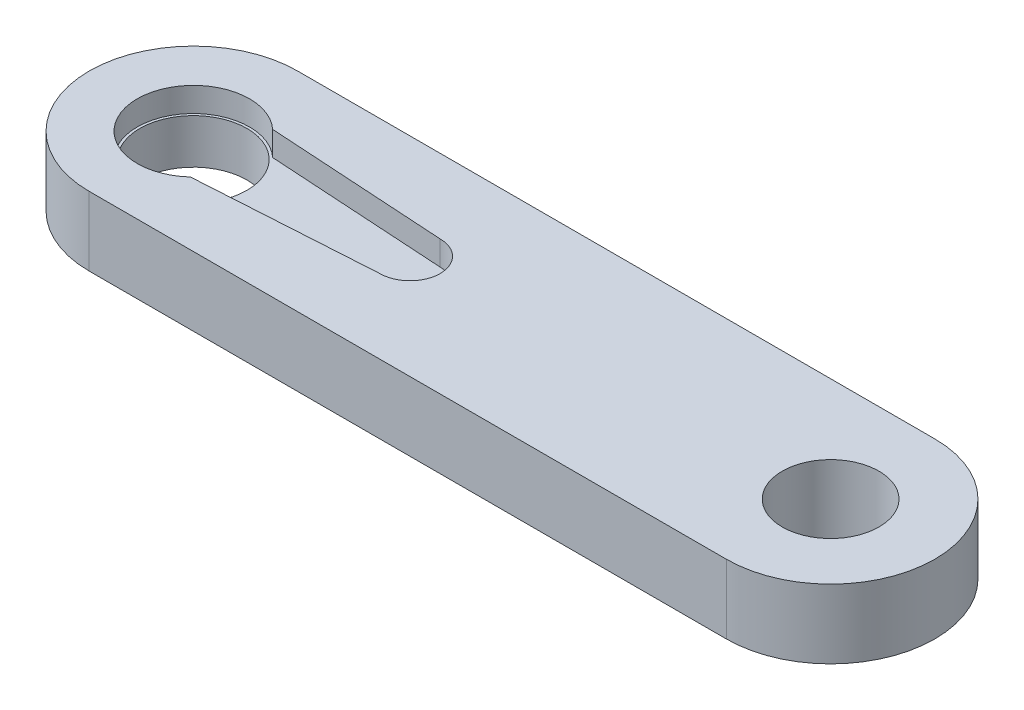
ISO-10303-21;
HEADER;
FILE_DESCRIPTION(('STEP AP214'),'2;1');
FILE_NAME('part.step','',(''),(''),'','','');
FILE_SCHEMA(('AUTOMOTIVE_DESIGN { 1 0 10303 214 1 1 1 1 }'));
ENDSEC;
DATA;
#1=APPLICATION_CONTEXT('core data for automotive mechanical design processes');
#2=APPLICATION_PROTOCOL_DEFINITION('international standard','automotive_design',2000,#1);
#3=PRODUCT_CONTEXT('',#1,'mechanical');
#4=PRODUCT('Part','Part','',(#3));
#5=PRODUCT_RELATED_PRODUCT_CATEGORY('part','',(#4));
#6=PRODUCT_DEFINITION_FORMATION('','',#4);
#7=PRODUCT_DEFINITION_CONTEXT('part definition',#1,'design');
#8=PRODUCT_DEFINITION('design','',#6,#7);
#9=PRODUCT_DEFINITION_SHAPE('','',#8);
#10=(LENGTH_UNIT() NAMED_UNIT(*) SI_UNIT(.MILLI.,.METRE.));
#11=(NAMED_UNIT(*) PLANE_ANGLE_UNIT() SI_UNIT($,.RADIAN.));
#12=(NAMED_UNIT(*) SI_UNIT($,.STERADIAN.) SOLID_ANGLE_UNIT());
#13=UNCERTAINTY_MEASURE_WITH_UNIT(LENGTH_MEASURE(1.E-05),#10,'distance_accuracy_value','');
#14=(GEOMETRIC_REPRESENTATION_CONTEXT(3) GLOBAL_UNCERTAINTY_ASSIGNED_CONTEXT((#13)) GLOBAL_UNIT_ASSIGNED_CONTEXT((#10,
#11,#12)) REPRESENTATION_CONTEXT('',''));
#15=CARTESIAN_POINT('',(0.,0.,0.));
#16=DIRECTION('',(0.,0.,1.));
#17=DIRECTION('',(1.,0.,0.));
#18=AXIS2_PLACEMENT_3D('',#15,#16,#17);
#19=CARTESIAN_POINT('',(12.2,3.,-7.));
#20=DIRECTION('',(0.,0.,1.));
#21=DIRECTION('',(1.,0.,0.));
#22=AXIS2_PLACEMENT_3D('',#19,#20,#21);
#23=PLANE('',#22);
#24=DIRECTION('',(-1.,0.,0.));
#25=VECTOR('',#24,1.);
#26=CARTESIAN_POINT('',(67.2,4.64,-7.));
#27=LINE('',#26,#25);
#28=CARTESIAN_POINT('',(55.,4.64,-7.));
#29=VERTEX_POINT('',#28);
#30=CARTESIAN_POINT('',(12.2,4.64,-7.));
#31=VERTEX_POINT('',#30);
#32=EDGE_CURVE('E137',#29,#31,#27,.T.);
#33=ORIENTED_EDGE('',*,*,#32,.F.);
#34=DIRECTION('',(0.,-1.,0.));
#35=VECTOR('',#34,1.);
#36=CARTESIAN_POINT('',(55.,3.,-7.));
#37=LINE('',#36,#35);
#38=CARTESIAN_POINT('',(55.,0.,-7.));
#39=VERTEX_POINT('',#38);
#40=EDGE_CURVE('E136',#29,#39,#37,.T.);
#41=ORIENTED_EDGE('',*,*,#40,.T.);
#42=DIRECTION('',(-1.,0.,0.));
#43=VECTOR('',#42,1.);
#44=CARTESIAN_POINT('',(12.2,0.,-7.));
#45=LINE('',#44,#43);
#46=CARTESIAN_POINT('',(12.2,0.,-7.));
#47=VERTEX_POINT('',#46);
#48=EDGE_CURVE('E134',#39,#47,#45,.T.);
#49=ORIENTED_EDGE('',*,*,#48,.T.);
#50=DIRECTION('',(0.,-1.,0.));
#51=VECTOR('',#50,1.);
#52=CARTESIAN_POINT('',(12.2,3.,-7.));
#53=LINE('',#52,#51);
#54=EDGE_CURVE('E155',#31,#47,#53,.T.);
#55=ORIENTED_EDGE('',*,*,#54,.F.);
#56=EDGE_LOOP('',(#33,#41,#49,#55));
#57=FACE_BOUND('',#56,.T.);
#58=ADVANCED_FACE('F40',(#57),#23,.F.);
#59=CARTESIAN_POINT('',(12.2,3.,7.));
#60=DIRECTION('',(0.,0.,-1.));
#61=DIRECTION('',(-1.,0.,0.));
#62=AXIS2_PLACEMENT_3D('',#59,#60,#61);
#63=PLANE('',#62);
#64=DIRECTION('',(1.,0.,0.));
#65=VECTOR('',#64,1.);
#66=CARTESIAN_POINT('',(12.2,0.,7.));
#67=LINE('',#66,#65);
#68=CARTESIAN_POINT('',(12.2,0.,7.));
#69=VERTEX_POINT('',#68);
#70=CARTESIAN_POINT('',(55.,0.,7.));
#71=VERTEX_POINT('',#70);
#72=EDGE_CURVE('E129',#69,#71,#67,.T.);
#73=ORIENTED_EDGE('',*,*,#72,.T.);
#74=DIRECTION('',(0.,-1.,0.));
#75=VECTOR('',#74,1.);
#76=CARTESIAN_POINT('',(55.,3.,7.));
#77=LINE('',#76,#75);
#78=CARTESIAN_POINT('',(55.,4.64,7.));
#79=VERTEX_POINT('',#78);
#80=EDGE_CURVE('E219',#79,#71,#77,.T.);
#81=ORIENTED_EDGE('',*,*,#80,.F.);
#82=DIRECTION('',(1.,0.,0.));
#83=VECTOR('',#82,1.);
#84=CARTESIAN_POINT('',(12.2,4.64,7.));
#85=LINE('',#84,#83);
#86=CARTESIAN_POINT('',(12.2,4.64,7.));
#87=VERTEX_POINT('',#86);
#88=EDGE_CURVE('E43',#87,#79,#85,.T.);
#89=ORIENTED_EDGE('',*,*,#88,.F.);
#90=DIRECTION('',(0.,-1.,0.));
#91=VECTOR('',#90,1.);
#92=CARTESIAN_POINT('',(12.2,3.,7.));
#93=LINE('',#92,#91);
#94=EDGE_CURVE('E133',#87,#69,#93,.T.);
#95=ORIENTED_EDGE('',*,*,#94,.T.);
#96=EDGE_LOOP('',(#73,#81,#89,#95));
#97=FACE_BOUND('',#96,.T.);
#98=ADVANCED_FACE('F196',(#97),#63,.F.);
#99=CARTESIAN_POINT('',(67.2,0.,0.));
#100=DIRECTION('',(0.,1.,0.));
#101=DIRECTION('',(0.,0.,1.));
#102=AXIS2_PLACEMENT_3D('',#99,#100,#101);
#103=PLANE('',#102);
#104=CARTESIAN_POINT('',(12.2,0.,0.));
#105=DIRECTION('',(0.,-1.,0.));
#106=DIRECTION('',(0.,0.,-1.));
#107=AXIS2_PLACEMENT_3D('',#104,#105,#106);
#108=CIRCLE('',#107,3.6);
#109=CARTESIAN_POINT('',(12.2,0.,-3.6));
#110=VERTEX_POINT('',#109);
#111=EDGE_CURVE('E128',#110,#110,#108,.T.);
#112=ORIENTED_EDGE('',*,*,#111,.F.);
#113=EDGE_LOOP('',(#112));
#114=FACE_BOUND('',#113,.T.);
#115=ORIENTED_EDGE('',*,*,#48,.F.);
#116=CARTESIAN_POINT('',(55.,0.,0.));
#117=DIRECTION('',(0.,1.,0.));
#118=DIRECTION('',(0.,0.,1.));
#119=AXIS2_PLACEMENT_3D('',#116,#117,#118);
#120=CIRCLE('',#119,7.);
#121=EDGE_CURVE('E217',#71,#39,#120,.T.);
#122=ORIENTED_EDGE('',*,*,#121,.F.);
#123=ORIENTED_EDGE('',*,*,#72,.F.);
#124=CARTESIAN_POINT('',(12.2,0.,0.));
#125=DIRECTION('',(0.,1.,0.));
#126=DIRECTION('',(0.,0.,1.));
#127=AXIS2_PLACEMENT_3D('',#124,#125,#126);
#128=CIRCLE('',#127,7.);
#129=EDGE_CURVE('E157',#47,#69,#128,.T.);
#130=ORIENTED_EDGE('',*,*,#129,.F.);
#131=EDGE_LOOP('',(#115,#122,#123,#130));
#132=FACE_BOUND('',#131,.T.);
#133=CARTESIAN_POINT('',(55.,0.,0.));
#134=DIRECTION('',(0.,1.,0.));
#135=DIRECTION('',(0.,0.,1.));
#136=AXIS2_PLACEMENT_3D('',#133,#134,#135);
#137=CIRCLE('',#136,3.25);
#138=CARTESIAN_POINT('',(55.,0.,3.25));
#139=VERTEX_POINT('',#138);
#140=EDGE_CURVE('E223',#139,#139,#137,.F.);
#141=ORIENTED_EDGE('',*,*,#140,.F.);
#142=EDGE_LOOP('',(#141));
#143=FACE_BOUND('',#142,.T.);
#144=ADVANCED_FACE('F201',(#114,#132,#143),#103,.F.);
#145=CARTESIAN_POINT('',(12.2,4.64,0.));
#146=DIRECTION('',(0.,1.,0.));
#147=DIRECTION('',(0.,0.,1.));
#148=AXIS2_PLACEMENT_3D('',#145,#146,#147);
#149=PLANE('',#148);
#150=ORIENTED_EDGE('',*,*,#88,.T.);
#151=CARTESIAN_POINT('',(55.,4.64,0.));
#152=DIRECTION('',(0.,1.,0.));
#153=DIRECTION('',(0.,0.,1.));
#154=AXIS2_PLACEMENT_3D('',#151,#152,#153);
#155=CIRCLE('',#154,7.);
#156=EDGE_CURVE('E215',#79,#29,#155,.T.);
#157=ORIENTED_EDGE('',*,*,#156,.T.);
#158=ORIENTED_EDGE('',*,*,#32,.T.);
#159=CARTESIAN_POINT('',(12.2,4.64,0.));
#160=DIRECTION('',(0.,1.,0.));
#161=DIRECTION('',(0.,0.,1.));
#162=AXIS2_PLACEMENT_3D('',#159,#160,#161);
#163=CIRCLE('',#162,7.);
#164=EDGE_CURVE('E139',#31,#87,#163,.T.);
#165=ORIENTED_EDGE('',*,*,#164,.T.);
#166=EDGE_LOOP('',(#150,#157,#158,#165));
#167=FACE_BOUND('',#166,.T.);
#168=DIRECTION('',(-0.998071858143405,0.,-0.0620690420593882));
#169=VECTOR('',#168,1.);
#170=CARTESIAN_POINT('',(26.7553968890811,4.64,-2.01999279047927));
#171=LINE('',#170,#169);
#172=CARTESIAN_POINT('',(26.7553968890811,4.64,-2.01999279047927));
#173=VERTEX_POINT('',#172);
#174=CARTESIAN_POINT('',(14.7618184422242,4.64,-2.76586085497446));
#175=VERTEX_POINT('',#174);
#176=EDGE_CURVE('E92',#173,#175,#171,.T.);
#177=ORIENTED_EDGE('',*,*,#176,.F.);
#178=CARTESIAN_POINT('',(26.75,4.64,0.));
#179=DIRECTION('',(0.,1.,0.));
#180=DIRECTION('',(0.,0.,1.));
#181=AXIS2_PLACEMENT_3D('',#178,#179,#180);
#182=CIRCLE('',#181,2.02);
#183=CARTESIAN_POINT('',(26.7553968890812,4.64,2.01999279047927));
#184=VERTEX_POINT('',#183);
#185=EDGE_CURVE('E124',#184,#173,#182,.T.);
#186=ORIENTED_EDGE('',*,*,#185,.F.);
#187=DIRECTION('',(0.998071858143405,0.,-0.0620690420593882));
#188=VECTOR('',#187,1.);
#189=CARTESIAN_POINT('',(14.7618184422242,4.64,2.76586085497446));
#190=LINE('',#189,#188);
#191=CARTESIAN_POINT('',(14.7618184422242,4.64,2.76586085497446));
#192=VERTEX_POINT('',#191);
#193=EDGE_CURVE('E50',#192,#184,#190,.T.);
#194=ORIENTED_EDGE('',*,*,#193,.F.);
#195=CARTESIAN_POINT('',(12.2,4.64,0.));
#196=DIRECTION('',(0.,1.,0.));
#197=DIRECTION('',(0.,0.,-1.));
#198=AXIS2_PLACEMENT_3D('',#195,#196,#197);
#199=CIRCLE('',#198,3.77);
#200=EDGE_CURVE('E107',#175,#192,#199,.T.);
#201=ORIENTED_EDGE('',*,*,#200,.F.);
#202=EDGE_LOOP('',(#177,#186,#194,#201));
#203=FACE_BOUND('',#202,.T.);
#204=CARTESIAN_POINT('',(55.,4.64,0.));
#205=DIRECTION('',(0.,1.,0.));
#206=DIRECTION('',(0.,0.,1.));
#207=AXIS2_PLACEMENT_3D('',#204,#205,#206);
#208=CIRCLE('',#207,3.25);
#209=CARTESIAN_POINT('',(55.,4.64,3.25));
#210=VERTEX_POINT('',#209);
#211=EDGE_CURVE('E229',#210,#210,#208,.T.);
#212=ORIENTED_EDGE('',*,*,#211,.F.);
#213=EDGE_LOOP('',(#212));
#214=FACE_BOUND('',#213,.T.);
#215=ADVANCED_FACE('F114',(#167,#203,#214),#149,.T.);
#216=CARTESIAN_POINT('',(67.2,3.,0.));
#217=DIRECTION('',(0.,1.,0.));
#218=DIRECTION('',(0.,0.,1.));
#219=AXIS2_PLACEMENT_3D('',#216,#217,#218);
#220=PLANE('',#219);
#221=CARTESIAN_POINT('',(12.2,3.,0.));
#222=DIRECTION('',(0.,1.,0.));
#223=DIRECTION('',(0.,0.,1.));
#224=AXIS2_PLACEMENT_3D('',#221,#222,#223);
#225=CIRCLE('',#224,3.6);
#226=CARTESIAN_POINT('',(12.2,3.,3.6));
#227=VERTEX_POINT('',#226);
#228=EDGE_CURVE('E160',#227,#227,#225,.T.);
#229=ORIENTED_EDGE('',*,*,#228,.F.);
#230=EDGE_LOOP('',(#229));
#231=FACE_BOUND('',#230,.T.);
#232=DIRECTION('',(0.998071858143405,0.,-0.0620690420593882));
#233=VECTOR('',#232,1.);
#234=CARTESIAN_POINT('',(14.7618184422242,3.,2.76586085497446));
#235=LINE('',#234,#233);
#236=CARTESIAN_POINT('',(14.7618184422242,3.,2.76586085497446));
#237=VERTEX_POINT('',#236);
#238=CARTESIAN_POINT('',(26.7553968890812,3.,2.01999279047927));
#239=VERTEX_POINT('',#238);
#240=EDGE_CURVE('E169',#237,#239,#235,.T.);
#241=ORIENTED_EDGE('',*,*,#240,.T.);
#242=CARTESIAN_POINT('',(26.75,3.,0.));
#243=DIRECTION('',(0.,1.,0.));
#244=DIRECTION('',(0.,0.,1.));
#245=AXIS2_PLACEMENT_3D('',#242,#243,#244);
#246=CIRCLE('',#245,2.02);
#247=CARTESIAN_POINT('',(26.7553968890811,3.,-2.01999279047927));
#248=VERTEX_POINT('',#247);
#249=EDGE_CURVE('E173',#239,#248,#246,.T.);
#250=ORIENTED_EDGE('',*,*,#249,.T.);
#251=DIRECTION('',(-0.998071858143405,0.,-0.0620690420593882));
#252=VECTOR('',#251,1.);
#253=CARTESIAN_POINT('',(26.7553968890811,3.,-2.01999279047927));
#254=LINE('',#253,#252);
#255=CARTESIAN_POINT('',(14.7618184422242,3.,-2.76586085497446));
#256=VERTEX_POINT('',#255);
#257=EDGE_CURVE('E176',#248,#256,#254,.T.);
#258=ORIENTED_EDGE('',*,*,#257,.T.);
#259=CARTESIAN_POINT('',(12.2,3.,0.));
#260=DIRECTION('',(0.,1.,0.));
#261=DIRECTION('',(0.,0.,-1.));
#262=AXIS2_PLACEMENT_3D('',#259,#260,#261);
#263=CIRCLE('',#262,3.77);
#264=EDGE_CURVE('E110',#256,#237,#263,.T.);
#265=ORIENTED_EDGE('',*,*,#264,.T.);
#266=EDGE_LOOP('',(#241,#250,#258,#265));
#267=FACE_BOUND('',#266,.T.);
#268=ADVANCED_FACE('F181',(#231,#267),#220,.T.);
#269=CARTESIAN_POINT('',(12.2,3.,0.));
#270=DIRECTION('',(0.,-1.,0.));
#271=DIRECTION('',(0.,0.,-1.));
#272=AXIS2_PLACEMENT_3D('',#269,#270,#271);
#273=CYLINDRICAL_SURFACE('',#272,7.);
#274=ORIENTED_EDGE('',*,*,#129,.T.);
#275=ORIENTED_EDGE('',*,*,#94,.F.);
#276=ORIENTED_EDGE('',*,*,#164,.F.);
#277=ORIENTED_EDGE('',*,*,#54,.T.);
#278=EDGE_LOOP('',(#274,#275,#276,#277));
#279=FACE_BOUND('',#278,.T.);
#280=ADVANCED_FACE('F192',(#279),#273,.T.);
#281=CARTESIAN_POINT('',(12.2,3.95,0.));
#282=DIRECTION('',(0.,-1.,0.));
#283=DIRECTION('',(0.,0.,-1.));
#284=AXIS2_PLACEMENT_3D('',#281,#282,#283);
#285=CYLINDRICAL_SURFACE('',#284,3.6);
#286=ORIENTED_EDGE('',*,*,#228,.T.);
#287=EDGE_LOOP('',(#286));
#288=FACE_BOUND('',#287,.T.);
#289=ORIENTED_EDGE('',*,*,#111,.T.);
#290=EDGE_LOOP('',(#289));
#291=FACE_BOUND('',#290,.T.);
#292=ADVANCED_FACE('F185',(#288,#291),#285,.F.);
#293=CARTESIAN_POINT('',(26.75,4.64,0.));
#294=DIRECTION('',(0.,-1.,0.));
#295=DIRECTION('',(0.,0.,-1.));
#296=AXIS2_PLACEMENT_3D('',#293,#294,#295);
#297=CYLINDRICAL_SURFACE('',#296,2.02);
#298=ORIENTED_EDGE('',*,*,#249,.F.);
#299=DIRECTION('',(0.,-1.,0.));
#300=VECTOR('',#299,1.);
#301=CARTESIAN_POINT('',(26.7553968890812,4.64,2.01999279047927));
#302=LINE('',#301,#300);
#303=EDGE_CURVE('E11',#184,#239,#302,.T.);
#304=ORIENTED_EDGE('',*,*,#303,.F.);
#305=ORIENTED_EDGE('',*,*,#185,.T.);
#306=DIRECTION('',(0.,-1.,0.));
#307=VECTOR('',#306,1.);
#308=CARTESIAN_POINT('',(26.7553968890811,4.64,-2.01999279047927));
#309=LINE('',#308,#307);
#310=EDGE_CURVE('E98',#173,#248,#309,.T.);
#311=ORIENTED_EDGE('',*,*,#310,.T.);
#312=EDGE_LOOP('',(#298,#304,#305,#311));
#313=FACE_BOUND('',#312,.T.);
#314=ADVANCED_FACE('F183',(#313),#297,.F.);
#315=CARTESIAN_POINT('',(26.7553968890811,4.64,-2.01999279047927));
#316=DIRECTION('',(-0.0620690420593882,0.,0.998071858143405));
#317=DIRECTION('',(0.998071858143405,0.,0.0620690420593882));
#318=AXIS2_PLACEMENT_3D('',#315,#316,#317);
#319=PLANE('',#318);
#320=ORIENTED_EDGE('',*,*,#257,.F.);
#321=ORIENTED_EDGE('',*,*,#310,.F.);
#322=ORIENTED_EDGE('',*,*,#176,.T.);
#323=DIRECTION('',(0.,-1.,0.));
#324=VECTOR('',#323,1.);
#325=CARTESIAN_POINT('',(14.7618184422242,4.64,-2.76586085497446));
#326=LINE('',#325,#324);
#327=EDGE_CURVE('E95',#175,#256,#326,.T.);
#328=ORIENTED_EDGE('',*,*,#327,.T.);
#329=EDGE_LOOP('',(#320,#321,#322,#328));
#330=FACE_BOUND('',#329,.T.);
#331=ADVANCED_FACE('F94',(#330),#319,.T.);
#332=CARTESIAN_POINT('',(12.2,4.64,0.));
#333=DIRECTION('',(0.,-1.,0.));
#334=DIRECTION('',(0.,0.,-1.));
#335=AXIS2_PLACEMENT_3D('',#332,#333,#334);
#336=CYLINDRICAL_SURFACE('',#335,3.77);
#337=ORIENTED_EDGE('',*,*,#264,.F.);
#338=ORIENTED_EDGE('',*,*,#327,.F.);
#339=ORIENTED_EDGE('',*,*,#200,.T.);
#340=DIRECTION('',(0.,-1.,0.));
#341=VECTOR('',#340,1.);
#342=CARTESIAN_POINT('',(14.7618184422242,4.64,2.76586085497446));
#343=LINE('',#342,#341);
#344=EDGE_CURVE('E117',#192,#237,#343,.T.);
#345=ORIENTED_EDGE('',*,*,#344,.T.);
#346=EDGE_LOOP('',(#337,#338,#339,#345));
#347=FACE_BOUND('',#346,.T.);
#348=ADVANCED_FACE('F106',(#347),#336,.F.);
#349=CARTESIAN_POINT('',(14.7618184422242,4.64,2.76586085497446));
#350=DIRECTION('',(-0.0620690420593882,0.,-0.998071858143405));
#351=DIRECTION('',(-0.998071858143405,0.,0.0620690420593882));
#352=AXIS2_PLACEMENT_3D('',#349,#350,#351);
#353=PLANE('',#352);
#354=ORIENTED_EDGE('',*,*,#240,.F.);
#355=ORIENTED_EDGE('',*,*,#344,.F.);
#356=ORIENTED_EDGE('',*,*,#193,.T.);
#357=ORIENTED_EDGE('',*,*,#303,.T.);
#358=EDGE_LOOP('',(#354,#355,#356,#357));
#359=FACE_BOUND('',#358,.T.);
#360=ADVANCED_FACE('F253',(#359),#353,.T.);
#361=CARTESIAN_POINT('',(55.,-9.19238815542512,0.));
#362=DIRECTION('',(0.,1.,0.));
#363=DIRECTION('',(0.,0.,1.));
#364=AXIS2_PLACEMENT_3D('',#361,#362,#363);
#365=CYLINDRICAL_SURFACE('',#364,3.25);
#366=ORIENTED_EDGE('',*,*,#140,.T.);
#367=EDGE_LOOP('',(#366));
#368=FACE_BOUND('',#367,.T.);
#369=ORIENTED_EDGE('',*,*,#211,.T.);
#370=EDGE_LOOP('',(#369));
#371=FACE_BOUND('',#370,.T.);
#372=ADVANCED_FACE('F251',(#368,#371),#365,.F.);
#373=CARTESIAN_POINT('',(55.,3.,0.));
#374=DIRECTION('',(0.,-1.,0.));
#375=DIRECTION('',(0.,0.,-1.));
#376=AXIS2_PLACEMENT_3D('',#373,#374,#375);
#377=CYLINDRICAL_SURFACE('',#376,7.);
#378=ORIENTED_EDGE('',*,*,#121,.T.);
#379=ORIENTED_EDGE('',*,*,#40,.F.);
#380=ORIENTED_EDGE('',*,*,#156,.F.);
#381=ORIENTED_EDGE('',*,*,#80,.T.);
#382=EDGE_LOOP('',(#378,#379,#380,#381));
#383=FACE_BOUND('',#382,.T.);
#384=ADVANCED_FACE('F213',(#383),#377,.T.);
#385=CLOSED_SHELL('',(#58,#98,#144,#215,#268,#280,#292,#314,#331,#348,#360,#372,#384));
#386=MANIFOLD_SOLID_BREP('B2',#385);
#387=ADVANCED_BREP_SHAPE_REPRESENTATION('',(#18,#386),#14);
#388=SHAPE_DEFINITION_REPRESENTATION(#9,#387);
ENDSEC;
END-ISO-10303-21;
